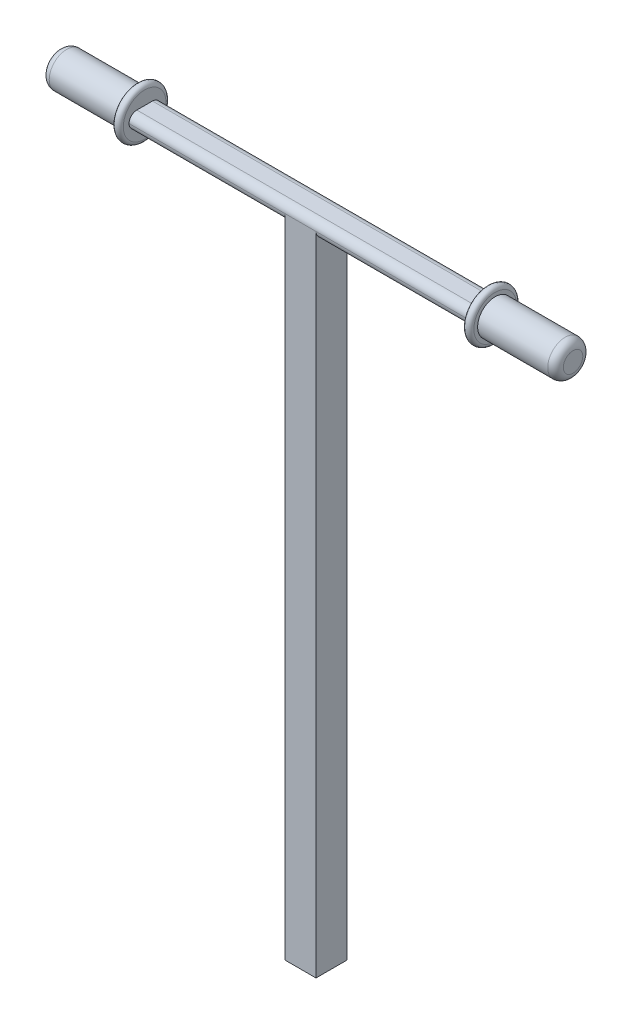
ISO-10303-21;
HEADER;
FILE_DESCRIPTION(('STEP AP214'),'2;1');
FILE_NAME('part.step','',(''),(''),'','','');
FILE_SCHEMA(('AUTOMOTIVE_DESIGN { 1 0 10303 214 1 1 1 1 }'));
ENDSEC;
DATA;
#1=APPLICATION_CONTEXT('core data for automotive mechanical design processes');
#2=APPLICATION_PROTOCOL_DEFINITION('international standard','automotive_design',2000,#1);
#3=PRODUCT_CONTEXT('',#1,'mechanical');
#4=PRODUCT('Part','Part','',(#3));
#5=PRODUCT_RELATED_PRODUCT_CATEGORY('part','',(#4));
#6=PRODUCT_DEFINITION_FORMATION('','',#4);
#7=PRODUCT_DEFINITION_CONTEXT('part definition',#1,'design');
#8=PRODUCT_DEFINITION('design','',#6,#7);
#9=PRODUCT_DEFINITION_SHAPE('','',#8);
#10=(LENGTH_UNIT() NAMED_UNIT(*) SI_UNIT(.MILLI.,.METRE.));
#11=(NAMED_UNIT(*) PLANE_ANGLE_UNIT() SI_UNIT($,.RADIAN.));
#12=(NAMED_UNIT(*) SI_UNIT($,.STERADIAN.) SOLID_ANGLE_UNIT());
#13=UNCERTAINTY_MEASURE_WITH_UNIT(LENGTH_MEASURE(1.E-05),#10,'distance_accuracy_value','');
#14=(GEOMETRIC_REPRESENTATION_CONTEXT(3) GLOBAL_UNCERTAINTY_ASSIGNED_CONTEXT((#13)) GLOBAL_UNIT_ASSIGNED_CONTEXT((#10,
#11,#12)) REPRESENTATION_CONTEXT('',''));
#15=CARTESIAN_POINT('',(0.,0.,0.));
#16=DIRECTION('',(0.,0.,1.));
#17=DIRECTION('',(1.,0.,0.));
#18=AXIS2_PLACEMENT_3D('',#15,#16,#17);
#19=CARTESIAN_POINT('',(-225.,280.,0.));
#20=DIRECTION('',(1.,0.,0.));
#21=DIRECTION('',(0.,1.,0.));
#22=AXIS2_PLACEMENT_3D('',#19,#20,#21);
#23=TOROIDAL_SURFACE('',#22,27.360679774998,4.99999999999994);
#24=CARTESIAN_POINT('',(-220.,280.,0.));
#25=DIRECTION('',(-1.,0.,0.));
#26=DIRECTION('',(0.,-1.,0.));
#27=AXIS2_PLACEMENT_3D('',#24,#25,#26);
#28=CIRCLE('',#27,27.360679774998);
#29=CARTESIAN_POINT('',(-220.,252.639320225002,0.));
#30=VERTEX_POINT('',#29);
#31=EDGE_CURVE('E268',#30,#30,#28,.F.);
#32=ORIENTED_EDGE('',*,*,#31,.F.);
#33=EDGE_LOOP('',(#32));
#34=FACE_BOUND('',#33,.T.);
#35=CARTESIAN_POINT('',(-230.,280.,0.));
#36=DIRECTION('',(-1.,0.,0.));
#37=DIRECTION('',(0.,-1.,0.));
#38=AXIS2_PLACEMENT_3D('',#35,#36,#37);
#39=CIRCLE('',#38,27.360679774998);
#40=CARTESIAN_POINT('',(-230.,252.639320225002,0.));
#41=VERTEX_POINT('',#40);
#42=EDGE_CURVE('E272',#41,#41,#39,.T.);
#43=ORIENTED_EDGE('',*,*,#42,.F.);
#44=EDGE_LOOP('',(#43));
#45=FACE_BOUND('',#44,.T.);
#46=ADVANCED_FACE('F41',(#34,#45),#23,.T.);
#47=CARTESIAN_POINT('',(225.,280.,0.));
#48=DIRECTION('',(1.,0.,0.));
#49=DIRECTION('',(0.,1.,0.));
#50=AXIS2_PLACEMENT_3D('',#47,#48,#49);
#51=TOROIDAL_SURFACE('',#50,27.360679774998,4.99999999999994);
#52=CARTESIAN_POINT('',(230.,280.,0.));
#53=DIRECTION('',(1.,0.,0.));
#54=DIRECTION('',(0.,1.,0.));
#55=AXIS2_PLACEMENT_3D('',#52,#53,#54);
#56=CIRCLE('',#55,27.360679774998);
#57=CARTESIAN_POINT('',(230.,307.360679774998,0.));
#58=VERTEX_POINT('',#57);
#59=EDGE_CURVE('E243',#58,#58,#56,.T.);
#60=ORIENTED_EDGE('',*,*,#59,.F.);
#61=EDGE_LOOP('',(#60));
#62=FACE_BOUND('',#61,.T.);
#63=CARTESIAN_POINT('',(220.,280.,0.));
#64=DIRECTION('',(1.,0.,0.));
#65=DIRECTION('',(0.,1.,0.));
#66=AXIS2_PLACEMENT_3D('',#63,#64,#65);
#67=CIRCLE('',#66,27.360679774998);
#68=CARTESIAN_POINT('',(220.,307.360679774998,0.));
#69=VERTEX_POINT('',#68);
#70=EDGE_CURVE('E264',#69,#69,#67,.F.);
#71=ORIENTED_EDGE('',*,*,#70,.F.);
#72=EDGE_LOOP('',(#71));
#73=FACE_BOUND('',#72,.T.);
#74=ADVANCED_FACE('F299',(#62,#73),#51,.T.);
#75=CARTESIAN_POINT('',(20.,-550.,-20.));
#76=DIRECTION('',(1.,0.,0.));
#77=DIRECTION('',(0.,0.,-1.));
#78=AXIS2_PLACEMENT_3D('',#75,#76,#77);
#79=PLANE('',#78);
#80=DIRECTION('',(0.,0.,-1.));
#81=VECTOR('',#80,1.);
#82=CARTESIAN_POINT('',(20.,270.,-20.));
#83=LINE('',#82,#81);
#84=CARTESIAN_POINT('',(20.,270.,9.99999999999999));
#85=VERTEX_POINT('',#84);
#86=CARTESIAN_POINT('',(20.,270.,-10.));
#87=VERTEX_POINT('',#86);
#88=EDGE_CURVE('E162',#85,#87,#83,.T.);
#89=ORIENTED_EDGE('',*,*,#88,.F.);
#90=CARTESIAN_POINT('',(20.,280.,10.));
#91=DIRECTION('',(1.,0.,0.));
#92=DIRECTION('',(0.,0.,-1.));
#93=AXIS2_PLACEMENT_3D('',#90,#91,#92);
#94=CIRCLE('',#93,10.);
#95=CARTESIAN_POINT('',(20.,280.,20.));
#96=VERTEX_POINT('',#95);
#97=EDGE_CURVE('E224',#85,#96,#94,.F.);
#98=ORIENTED_EDGE('',*,*,#97,.T.);
#99=DIRECTION('',(0.,1.,0.));
#100=VECTOR('',#99,1.);
#101=CARTESIAN_POINT('',(20.,-550.,20.));
#102=LINE('',#101,#100);
#103=CARTESIAN_POINT('',(20.,-550.,20.));
#104=VERTEX_POINT('',#103);
#105=EDGE_CURVE('E160',#104,#96,#102,.T.);
#106=ORIENTED_EDGE('',*,*,#105,.F.);
#107=DIRECTION('',(0.,0.,-1.));
#108=VECTOR('',#107,1.);
#109=CARTESIAN_POINT('',(20.,-550.,-20.));
#110=LINE('',#109,#108);
#111=CARTESIAN_POINT('',(20.,-550.,-20.));
#112=VERTEX_POINT('',#111);
#113=EDGE_CURVE('E151',#104,#112,#110,.T.);
#114=ORIENTED_EDGE('',*,*,#113,.T.);
#115=DIRECTION('',(0.,1.,0.));
#116=VECTOR('',#115,1.);
#117=CARTESIAN_POINT('',(20.,-550.,-20.));
#118=LINE('',#117,#116);
#119=CARTESIAN_POINT('',(20.,280.,-20.));
#120=VERTEX_POINT('',#119);
#121=EDGE_CURVE('E133',#112,#120,#118,.T.);
#122=ORIENTED_EDGE('',*,*,#121,.T.);
#123=CARTESIAN_POINT('',(20.,280.,-10.));
#124=DIRECTION('',(1.,0.,0.));
#125=DIRECTION('',(0.,0.,-1.));
#126=AXIS2_PLACEMENT_3D('',#123,#124,#125);
#127=CIRCLE('',#126,10.);
#128=EDGE_CURVE('E218',#120,#87,#127,.F.);
#129=ORIENTED_EDGE('',*,*,#128,.T.);
#130=EDGE_LOOP('',(#89,#98,#106,#114,#122,#129));
#131=FACE_BOUND('',#130,.T.);
#132=ADVANCED_FACE('F158',(#131),#79,.T.);
#133=CARTESIAN_POINT('',(-20.,-550.,20.));
#134=DIRECTION('',(0.,0.,1.));
#135=DIRECTION('',(1.,0.,0.));
#136=AXIS2_PLACEMENT_3D('',#133,#134,#135);
#137=PLANE('',#136);
#138=ORIENTED_EDGE('',*,*,#105,.T.);
#139=DIRECTION('',(1.,0.,0.));
#140=VECTOR('',#139,1.);
#141=CARTESIAN_POINT('',(-20.,280.,20.));
#142=LINE('',#141,#140);
#143=CARTESIAN_POINT('',(-20.,280.,20.));
#144=VERTEX_POINT('',#143);
#145=EDGE_CURVE('E198',#96,#144,#142,.F.);
#146=ORIENTED_EDGE('',*,*,#145,.T.);
#147=DIRECTION('',(0.,1.,0.));
#148=VECTOR('',#147,1.);
#149=CARTESIAN_POINT('',(-20.,-550.,20.));
#150=LINE('',#149,#148);
#151=CARTESIAN_POINT('',(-20.,-550.,20.));
#152=VERTEX_POINT('',#151);
#153=EDGE_CURVE('E177',#152,#144,#150,.T.);
#154=ORIENTED_EDGE('',*,*,#153,.F.);
#155=DIRECTION('',(1.,0.,0.));
#156=VECTOR('',#155,1.);
#157=CARTESIAN_POINT('',(-20.,-550.,20.));
#158=LINE('',#157,#156);
#159=EDGE_CURVE('E144',#152,#104,#158,.T.);
#160=ORIENTED_EDGE('',*,*,#159,.T.);
#161=EDGE_LOOP('',(#138,#146,#154,#160));
#162=FACE_BOUND('',#161,.T.);
#163=ADVANCED_FACE('F342',(#162),#137,.T.);
#164=CARTESIAN_POINT('',(-20.,-550.,-20.));
#165=DIRECTION('',(-1.,0.,0.));
#166=DIRECTION('',(0.,0.,1.));
#167=AXIS2_PLACEMENT_3D('',#164,#165,#166);
#168=PLANE('',#167);
#169=DIRECTION('',(0.,0.,1.));
#170=VECTOR('',#169,1.);
#171=CARTESIAN_POINT('',(-20.,270.,-20.));
#172=LINE('',#171,#170);
#173=CARTESIAN_POINT('',(-20.,270.,-10.));
#174=VERTEX_POINT('',#173);
#175=CARTESIAN_POINT('',(-20.,270.,9.99999999999999));
#176=VERTEX_POINT('',#175);
#177=EDGE_CURVE('E166',#174,#176,#172,.T.);
#178=ORIENTED_EDGE('',*,*,#177,.F.);
#179=CARTESIAN_POINT('',(-20.,280.,-10.));
#180=DIRECTION('',(-1.,0.,0.));
#181=DIRECTION('',(0.,0.,1.));
#182=AXIS2_PLACEMENT_3D('',#179,#180,#181);
#183=CIRCLE('',#182,10.);
#184=CARTESIAN_POINT('',(-20.,280.,-20.));
#185=VERTEX_POINT('',#184);
#186=EDGE_CURVE('E208',#174,#185,#183,.F.);
#187=ORIENTED_EDGE('',*,*,#186,.T.);
#188=DIRECTION('',(0.,1.,0.));
#189=VECTOR('',#188,1.);
#190=CARTESIAN_POINT('',(-20.,-550.,-20.));
#191=LINE('',#190,#189);
#192=CARTESIAN_POINT('',(-20.,-550.,-20.));
#193=VERTEX_POINT('',#192);
#194=EDGE_CURVE('E143',#193,#185,#191,.T.);
#195=ORIENTED_EDGE('',*,*,#194,.F.);
#196=DIRECTION('',(0.,0.,1.));
#197=VECTOR('',#196,1.);
#198=CARTESIAN_POINT('',(-20.,-550.,-20.));
#199=LINE('',#198,#197);
#200=EDGE_CURVE('E154',#193,#152,#199,.T.);
#201=ORIENTED_EDGE('',*,*,#200,.T.);
#202=ORIENTED_EDGE('',*,*,#153,.T.);
#203=CARTESIAN_POINT('',(-20.,280.,10.));
#204=DIRECTION('',(-1.,0.,0.));
#205=DIRECTION('',(0.,0.,1.));
#206=AXIS2_PLACEMENT_3D('',#203,#204,#205);
#207=CIRCLE('',#206,10.);
#208=EDGE_CURVE('E227',#144,#176,#207,.F.);
#209=ORIENTED_EDGE('',*,*,#208,.T.);
#210=EDGE_LOOP('',(#178,#187,#195,#201,#202,#209));
#211=FACE_BOUND('',#210,.T.);
#212=ADVANCED_FACE('F345',(#211),#168,.T.);
#213=CARTESIAN_POINT('',(-20.,-550.,-20.));
#214=DIRECTION('',(0.,0.,-1.));
#215=DIRECTION('',(-1.,0.,0.));
#216=AXIS2_PLACEMENT_3D('',#213,#214,#215);
#217=PLANE('',#216);
#218=ORIENTED_EDGE('',*,*,#194,.T.);
#219=DIRECTION('',(-1.,0.,0.));
#220=VECTOR('',#219,1.);
#221=CARTESIAN_POINT('',(-20.,280.,-20.));
#222=LINE('',#221,#220);
#223=EDGE_CURVE('E138',#185,#120,#222,.F.);
#224=ORIENTED_EDGE('',*,*,#223,.T.);
#225=ORIENTED_EDGE('',*,*,#121,.F.);
#226=DIRECTION('',(-1.,0.,0.));
#227=VECTOR('',#226,1.);
#228=CARTESIAN_POINT('',(-20.,-550.,-20.));
#229=LINE('',#228,#227);
#230=EDGE_CURVE('E136',#112,#193,#229,.T.);
#231=ORIENTED_EDGE('',*,*,#230,.T.);
#232=EDGE_LOOP('',(#218,#224,#225,#231));
#233=FACE_BOUND('',#232,.T.);
#234=ADVANCED_FACE('F135',(#233),#217,.T.);
#235=CARTESIAN_POINT('',(0.,-550.,0.));
#236=DIRECTION('',(0.,1.,0.));
#237=DIRECTION('',(0.,0.,1.));
#238=AXIS2_PLACEMENT_3D('',#235,#236,#237);
#239=PLANE('',#238);
#240=ORIENTED_EDGE('',*,*,#113,.F.);
#241=ORIENTED_EDGE('',*,*,#159,.F.);
#242=ORIENTED_EDGE('',*,*,#200,.F.);
#243=ORIENTED_EDGE('',*,*,#230,.F.);
#244=EDGE_LOOP('',(#240,#241,#242,#243));
#245=FACE_BOUND('',#244,.T.);
#246=ADVANCED_FACE('F149',(#245),#239,.F.);
#247=CARTESIAN_POINT('',(0.,290.,0.));
#248=DIRECTION('',(0.,1.,0.));
#249=DIRECTION('',(0.,0.,1.));
#250=AXIS2_PLACEMENT_3D('',#247,#248,#249);
#251=PLANE('',#250);
#252=DIRECTION('',(0.,0.,1.));
#253=VECTOR('',#252,1.);
#254=CARTESIAN_POINT('',(220.,290.,-460.454310910905));
#255=LINE('',#254,#253);
#256=CARTESIAN_POINT('',(220.,290.,-10.));
#257=VERTEX_POINT('',#256);
#258=CARTESIAN_POINT('',(220.,290.,10.));
#259=VERTEX_POINT('',#258);
#260=EDGE_CURVE('E410',#257,#259,#255,.T.);
#261=ORIENTED_EDGE('',*,*,#260,.F.);
#262=DIRECTION('',(-1.,0.,0.));
#263=VECTOR('',#262,1.);
#264=CARTESIAN_POINT('',(0.,290.,-10.));
#265=LINE('',#264,#263);
#266=CARTESIAN_POINT('',(-220.,290.,-10.));
#267=VERTEX_POINT('',#266);
#268=EDGE_CURVE('E205',#257,#267,#265,.T.);
#269=ORIENTED_EDGE('',*,*,#268,.T.);
#270=DIRECTION('',(0.,0.,1.));
#271=VECTOR('',#270,1.);
#272=CARTESIAN_POINT('',(-220.,290.,-460.454310910905));
#273=LINE('',#272,#271);
#274=CARTESIAN_POINT('',(-220.,290.,10.));
#275=VERTEX_POINT('',#274);
#276=EDGE_CURVE('E413',#267,#275,#273,.T.);
#277=ORIENTED_EDGE('',*,*,#276,.T.);
#278=DIRECTION('',(1.,0.,0.));
#279=VECTOR('',#278,1.);
#280=CARTESIAN_POINT('',(0.,290.,10.));
#281=LINE('',#280,#279);
#282=EDGE_CURVE('E202',#275,#259,#281,.T.);
#283=ORIENTED_EDGE('',*,*,#282,.T.);
#284=EDGE_LOOP('',(#261,#269,#277,#283));
#285=FACE_BOUND('',#284,.T.);
#286=ADVANCED_FACE('F354',(#285),#251,.T.);
#287=CARTESIAN_POINT('',(220.,270.,-460.454310910905));
#288=DIRECTION('',(0.,-1.,0.));
#289=DIRECTION('',(1.,0.,0.));
#290=AXIS2_PLACEMENT_3D('',#287,#288,#289);
#291=PLANE('',#290);
#292=DIRECTION('',(0.,0.,1.));
#293=VECTOR('',#292,1.);
#294=CARTESIAN_POINT('',(-220.,270.,-460.454310910905));
#295=LINE('',#294,#293);
#296=CARTESIAN_POINT('',(-220.,270.,-10.));
#297=VERTEX_POINT('',#296);
#298=CARTESIAN_POINT('',(-220.,270.,10.));
#299=VERTEX_POINT('',#298);
#300=EDGE_CURVE('E401',#297,#299,#295,.T.);
#301=ORIENTED_EDGE('',*,*,#300,.F.);
#302=DIRECTION('',(1.,0.,0.));
#303=VECTOR('',#302,1.);
#304=CARTESIAN_POINT('',(220.,270.,-10.));
#305=LINE('',#304,#303);
#306=EDGE_CURVE('E185',#297,#174,#305,.T.);
#307=ORIENTED_EDGE('',*,*,#306,.T.);
#308=ORIENTED_EDGE('',*,*,#177,.T.);
#309=DIRECTION('',(1.,0.,0.));
#310=VECTOR('',#309,1.);
#311=CARTESIAN_POINT('',(220.,270.,10.));
#312=LINE('',#311,#310);
#313=EDGE_CURVE('E182',#176,#299,#312,.F.);
#314=ORIENTED_EDGE('',*,*,#313,.T.);
#315=EDGE_LOOP('',(#301,#307,#308,#314));
#316=FACE_BOUND('',#315,.T.);
#317=ADVANCED_FACE('F357',(#316),#291,.T.);
#318=ORIENTED_EDGE('',*,*,#88,.T.);
#319=DIRECTION('',(1.,0.,0.));
#320=VECTOR('',#319,1.);
#321=CARTESIAN_POINT('',(220.,270.,-10.));
#322=LINE('',#321,#320);
#323=CARTESIAN_POINT('',(220.,270.,-10.));
#324=VERTEX_POINT('',#323);
#325=EDGE_CURVE('E195',#87,#324,#322,.T.);
#326=ORIENTED_EDGE('',*,*,#325,.T.);
#327=DIRECTION('',(0.,0.,1.));
#328=VECTOR('',#327,1.);
#329=CARTESIAN_POINT('',(220.,270.,-460.454310910905));
#330=LINE('',#329,#328);
#331=CARTESIAN_POINT('',(220.,270.,10.));
#332=VERTEX_POINT('',#331);
#333=EDGE_CURVE('E404',#324,#332,#330,.T.);
#334=ORIENTED_EDGE('',*,*,#333,.T.);
#335=DIRECTION('',(1.,0.,0.));
#336=VECTOR('',#335,1.);
#337=CARTESIAN_POINT('',(220.,270.,10.));
#338=LINE('',#337,#336);
#339=EDGE_CURVE('E191',#332,#85,#338,.F.);
#340=ORIENTED_EDGE('',*,*,#339,.T.);
#341=EDGE_LOOP('',(#318,#326,#334,#340));
#342=FACE_BOUND('',#341,.T.);
#343=ADVANCED_FACE('F361',(#342),#291,.T.);
#344=CARTESIAN_POINT('',(230.,280.,0.));
#345=DIRECTION('',(1.,0.,0.));
#346=DIRECTION('',(0.,1.,0.));
#347=AXIS2_PLACEMENT_3D('',#344,#345,#346);
#348=PLANE('',#347);
#349=ORIENTED_EDGE('',*,*,#59,.T.);
#350=EDGE_LOOP('',(#349));
#351=FACE_BOUND('',#350,.T.);
#352=CARTESIAN_POINT('',(230.,280.,0.));
#353=DIRECTION('',(1.,0.,0.));
#354=DIRECTION('',(0.,1.,0.));
#355=AXIS2_PLACEMENT_3D('',#352,#353,#354);
#356=CIRCLE('',#355,22.5);
#357=CARTESIAN_POINT('',(230.,302.5,0.));
#358=VERTEX_POINT('',#357);
#359=EDGE_CURVE('E176',#358,#358,#356,.T.);
#360=ORIENTED_EDGE('',*,*,#359,.F.);
#361=EDGE_LOOP('',(#360));
#362=FACE_BOUND('',#361,.T.);
#363=ADVANCED_FACE('F367',(#351,#362),#348,.T.);
#364=CARTESIAN_POINT('',(220.,280.,0.));
#365=DIRECTION('',(1.,0.,0.));
#366=DIRECTION('',(0.,1.,0.));
#367=AXIS2_PLACEMENT_3D('',#364,#365,#366);
#368=PLANE('',#367);
#369=ORIENTED_EDGE('',*,*,#70,.T.);
#370=EDGE_LOOP('',(#369));
#371=FACE_BOUND('',#370,.T.);
#372=CARTESIAN_POINT('',(220.,280.,-10.));
#373=DIRECTION('',(1.,0.,0.));
#374=DIRECTION('',(0.,1.,0.));
#375=AXIS2_PLACEMENT_3D('',#372,#373,#374);
#376=CIRCLE('',#375,10.);
#377=CARTESIAN_POINT('',(220.,280.,-20.));
#378=VERTEX_POINT('',#377);
#379=EDGE_CURVE('E215',#324,#378,#376,.T.);
#380=ORIENTED_EDGE('',*,*,#379,.T.);
#381=CARTESIAN_POINT('',(220.,280.,-10.));
#382=DIRECTION('',(1.,0.,0.));
#383=DIRECTION('',(0.,1.,0.));
#384=AXIS2_PLACEMENT_3D('',#381,#382,#383);
#385=CIRCLE('',#384,10.);
#386=EDGE_CURVE('E235',#378,#257,#385,.T.);
#387=ORIENTED_EDGE('',*,*,#386,.T.);
#388=ORIENTED_EDGE('',*,*,#260,.T.);
#389=CARTESIAN_POINT('',(220.,280.,10.));
#390=DIRECTION('',(1.,0.,0.));
#391=DIRECTION('',(0.,1.,0.));
#392=AXIS2_PLACEMENT_3D('',#389,#390,#391);
#393=CIRCLE('',#392,10.);
#394=CARTESIAN_POINT('',(220.,280.,20.));
#395=VERTEX_POINT('',#394);
#396=EDGE_CURVE('E65',#259,#395,#393,.T.);
#397=ORIENTED_EDGE('',*,*,#396,.T.);
#398=CARTESIAN_POINT('',(220.,280.,10.));
#399=DIRECTION('',(1.,0.,0.));
#400=DIRECTION('',(0.,1.,0.));
#401=AXIS2_PLACEMENT_3D('',#398,#399,#400);
#402=CIRCLE('',#401,10.);
#403=EDGE_CURVE('E221',#395,#332,#402,.T.);
#404=ORIENTED_EDGE('',*,*,#403,.T.);
#405=ORIENTED_EDGE('',*,*,#333,.F.);
#406=EDGE_LOOP('',(#380,#387,#388,#397,#404,#405));
#407=FACE_BOUND('',#406,.T.);
#408=ADVANCED_FACE('F363',(#371,#407),#368,.F.);
#409=CARTESIAN_POINT('',(330.,280.,0.));
#410=DIRECTION('',(-1.,0.,0.));
#411=DIRECTION('',(0.,-1.,0.));
#412=AXIS2_PLACEMENT_3D('',#409,#410,#411);
#413=CYLINDRICAL_SURFACE('',#412,22.5);
#414=CARTESIAN_POINT('',(320.,280.,0.));
#415=DIRECTION('',(1.,0.,0.));
#416=DIRECTION('',(0.,1.,0.));
#417=AXIS2_PLACEMENT_3D('',#414,#415,#416);
#418=CIRCLE('',#417,22.5);
#419=CARTESIAN_POINT('',(320.,302.5,0.));
#420=VERTEX_POINT('',#419);
#421=EDGE_CURVE('E11',#420,#420,#418,.F.);
#422=ORIENTED_EDGE('',*,*,#421,.T.);
#423=EDGE_LOOP('',(#422));
#424=FACE_BOUND('',#423,.T.);
#425=ORIENTED_EDGE('',*,*,#359,.T.);
#426=EDGE_LOOP('',(#425));
#427=FACE_BOUND('',#426,.T.);
#428=ADVANCED_FACE('F366',(#424,#427),#413,.T.);
#429=CARTESIAN_POINT('',(330.,280.,0.));
#430=DIRECTION('',(1.,0.,0.));
#431=DIRECTION('',(0.,1.,0.));
#432=AXIS2_PLACEMENT_3D('',#429,#430,#431);
#433=PLANE('',#432);
#434=CARTESIAN_POINT('',(330.,280.,0.));
#435=DIRECTION('',(1.,0.,0.));
#436=DIRECTION('',(0.,1.,0.));
#437=AXIS2_PLACEMENT_3D('',#434,#435,#436);
#438=CIRCLE('',#437,12.5);
#439=CARTESIAN_POINT('',(330.,292.5,0.));
#440=VERTEX_POINT('',#439);
#441=EDGE_CURVE('E50',#440,#440,#438,.T.);
#442=ORIENTED_EDGE('',*,*,#441,.T.);
#443=EDGE_LOOP('',(#442));
#444=FACE_BOUND('',#443,.T.);
#445=ADVANCED_FACE('F287',(#444),#433,.T.);
#446=CARTESIAN_POINT('',(-230.,280.,0.));
#447=DIRECTION('',(-1.,0.,0.));
#448=DIRECTION('',(0.,1.,0.));
#449=AXIS2_PLACEMENT_3D('',#446,#447,#448);
#450=PLANE('',#449);
#451=ORIENTED_EDGE('',*,*,#42,.T.);
#452=EDGE_LOOP('',(#451));
#453=FACE_BOUND('',#452,.T.);
#454=CARTESIAN_POINT('',(-230.,280.,0.));
#455=DIRECTION('',(1.,0.,0.));
#456=DIRECTION('',(0.,1.,0.));
#457=AXIS2_PLACEMENT_3D('',#454,#455,#456);
#458=CIRCLE('',#457,22.5);
#459=CARTESIAN_POINT('',(-230.,302.5,0.));
#460=VERTEX_POINT('',#459);
#461=EDGE_CURVE('E253',#460,#460,#458,.T.);
#462=ORIENTED_EDGE('',*,*,#461,.T.);
#463=EDGE_LOOP('',(#462));
#464=FACE_BOUND('',#463,.T.);
#465=ADVANCED_FACE('F377',(#453,#464),#450,.T.);
#466=CARTESIAN_POINT('',(-220.,280.,0.));
#467=DIRECTION('',(-1.,0.,0.));
#468=DIRECTION('',(0.,1.,0.));
#469=AXIS2_PLACEMENT_3D('',#466,#467,#468);
#470=PLANE('',#469);
#471=ORIENTED_EDGE('',*,*,#31,.T.);
#472=EDGE_LOOP('',(#471));
#473=FACE_BOUND('',#472,.T.);
#474=ORIENTED_EDGE('',*,*,#276,.F.);
#475=CARTESIAN_POINT('',(-220.,280.,-10.));
#476=DIRECTION('',(-1.,0.,0.));
#477=DIRECTION('',(0.,-1.,0.));
#478=AXIS2_PLACEMENT_3D('',#475,#476,#477);
#479=CIRCLE('',#478,10.);
#480=CARTESIAN_POINT('',(-220.,280.,-20.));
#481=VERTEX_POINT('',#480);
#482=EDGE_CURVE('E232',#267,#481,#479,.T.);
#483=ORIENTED_EDGE('',*,*,#482,.T.);
#484=CARTESIAN_POINT('',(-220.,280.,-10.));
#485=DIRECTION('',(-1.,0.,0.));
#486=DIRECTION('',(0.,-1.,0.));
#487=AXIS2_PLACEMENT_3D('',#484,#485,#486);
#488=CIRCLE('',#487,10.);
#489=EDGE_CURVE('E212',#481,#297,#488,.T.);
#490=ORIENTED_EDGE('',*,*,#489,.T.);
#491=ORIENTED_EDGE('',*,*,#300,.T.);
#492=CARTESIAN_POINT('',(-220.,280.,10.));
#493=DIRECTION('',(-1.,0.,0.));
#494=DIRECTION('',(0.,-1.,0.));
#495=AXIS2_PLACEMENT_3D('',#492,#493,#494);
#496=CIRCLE('',#495,10.);
#497=CARTESIAN_POINT('',(-220.,280.,20.));
#498=VERTEX_POINT('',#497);
#499=EDGE_CURVE('E57',#299,#498,#496,.T.);
#500=ORIENTED_EDGE('',*,*,#499,.T.);
#501=CARTESIAN_POINT('',(-220.,280.,10.));
#502=DIRECTION('',(-1.,0.,0.));
#503=DIRECTION('',(0.,-1.,0.));
#504=AXIS2_PLACEMENT_3D('',#501,#502,#503);
#505=CIRCLE('',#504,10.);
#506=EDGE_CURVE('E240',#498,#275,#505,.T.);
#507=ORIENTED_EDGE('',*,*,#506,.T.);
#508=EDGE_LOOP('',(#474,#483,#490,#491,#500,#507));
#509=FACE_BOUND('',#508,.T.);
#510=ADVANCED_FACE('F378',(#473,#509),#470,.F.);
#511=CARTESIAN_POINT('',(-330.,280.,0.));
#512=DIRECTION('',(1.,0.,0.));
#513=DIRECTION('',(0.,1.,0.));
#514=AXIS2_PLACEMENT_3D('',#511,#512,#513);
#515=CYLINDRICAL_SURFACE('',#514,22.5);
#516=CARTESIAN_POINT('',(-320.,280.,0.));
#517=DIRECTION('',(-1.,0.,0.));
#518=DIRECTION('',(0.,-1.,0.));
#519=AXIS2_PLACEMENT_3D('',#516,#517,#518);
#520=CIRCLE('',#519,22.5);
#521=CARTESIAN_POINT('',(-320.,257.5,0.));
#522=VERTEX_POINT('',#521);
#523=EDGE_CURVE('E276',#522,#522,#520,.F.);
#524=ORIENTED_EDGE('',*,*,#523,.T.);
#525=EDGE_LOOP('',(#524));
#526=FACE_BOUND('',#525,.T.);
#527=ORIENTED_EDGE('',*,*,#461,.F.);
#528=EDGE_LOOP('',(#527));
#529=FACE_BOUND('',#528,.T.);
#530=ADVANCED_FACE('F381',(#526,#529),#515,.T.);
#531=CARTESIAN_POINT('',(-330.,280.,0.));
#532=DIRECTION('',(-1.,0.,0.));
#533=DIRECTION('',(0.,1.,0.));
#534=AXIS2_PLACEMENT_3D('',#531,#532,#533);
#535=PLANE('',#534);
#536=CARTESIAN_POINT('',(-330.,280.,0.));
#537=DIRECTION('',(-1.,0.,0.));
#538=DIRECTION('',(0.,-1.,0.));
#539=AXIS2_PLACEMENT_3D('',#536,#537,#538);
#540=CIRCLE('',#539,12.5);
#541=CARTESIAN_POINT('',(-330.,267.5,0.));
#542=VERTEX_POINT('',#541);
#543=EDGE_CURVE('E280',#542,#542,#540,.T.);
#544=ORIENTED_EDGE('',*,*,#543,.T.);
#545=EDGE_LOOP('',(#544));
#546=FACE_BOUND('',#545,.T.);
#547=ADVANCED_FACE('F332',(#546),#535,.T.);
#548=CARTESIAN_POINT('',(220.,280.,-10.));
#549=DIRECTION('',(1.,0.,0.));
#550=DIRECTION('',(0.,1.,0.));
#551=AXIS2_PLACEMENT_3D('',#548,#549,#550);
#552=CYLINDRICAL_SURFACE('',#551,10.);
#553=ORIENTED_EDGE('',*,*,#325,.F.);
#554=ORIENTED_EDGE('',*,*,#128,.F.);
#555=DIRECTION('',(1.,0.,0.));
#556=VECTOR('',#555,1.);
#557=CARTESIAN_POINT('',(-20.0000000000001,280.,-20.));
#558=LINE('',#557,#556);
#559=EDGE_CURVE('E248',#378,#120,#558,.F.);
#560=ORIENTED_EDGE('',*,*,#559,.F.);
#561=ORIENTED_EDGE('',*,*,#379,.F.);
#562=EDGE_LOOP('',(#553,#554,#560,#561));
#563=FACE_BOUND('',#562,.T.);
#564=ADVANCED_FACE('F328',(#563),#552,.T.);
#565=CARTESIAN_POINT('',(0.,280.,-10.));
#566=DIRECTION('',(-1.,0.,0.));
#567=DIRECTION('',(0.,0.,1.));
#568=AXIS2_PLACEMENT_3D('',#565,#566,#567);
#569=CYLINDRICAL_SURFACE('',#568,10.);
#570=DIRECTION('',(-1.,0.,0.));
#571=VECTOR('',#570,1.);
#572=CARTESIAN_POINT('',(-20.,280.,-20.));
#573=LINE('',#572,#571);
#574=EDGE_CURVE('E244',#481,#185,#573,.F.);
#575=ORIENTED_EDGE('',*,*,#574,.F.);
#576=ORIENTED_EDGE('',*,*,#482,.F.);
#577=ORIENTED_EDGE('',*,*,#268,.F.);
#578=ORIENTED_EDGE('',*,*,#386,.F.);
#579=ORIENTED_EDGE('',*,*,#559,.T.);
#580=ORIENTED_EDGE('',*,*,#223,.F.);
#581=EDGE_LOOP('',(#575,#576,#577,#578,#579,#580));
#582=FACE_BOUND('',#581,.T.);
#583=ADVANCED_FACE('F331',(#582),#569,.T.);
#584=CARTESIAN_POINT('',(220.,280.,-10.));
#585=DIRECTION('',(1.,0.,0.));
#586=DIRECTION('',(0.,1.,0.));
#587=AXIS2_PLACEMENT_3D('',#584,#585,#586);
#588=CYLINDRICAL_SURFACE('',#587,10.);
#589=ORIENTED_EDGE('',*,*,#489,.F.);
#590=ORIENTED_EDGE('',*,*,#574,.T.);
#591=ORIENTED_EDGE('',*,*,#186,.F.);
#592=ORIENTED_EDGE('',*,*,#306,.F.);
#593=EDGE_LOOP('',(#589,#590,#591,#592));
#594=FACE_BOUND('',#593,.T.);
#595=ADVANCED_FACE('F320',(#594),#588,.T.);
#596=CARTESIAN_POINT('',(-20.0000000000001,280.,10.));
#597=DIRECTION('',(1.,0.,0.));
#598=DIRECTION('',(0.,1.,0.));
#599=AXIS2_PLACEMENT_3D('',#596,#597,#598);
#600=CYLINDRICAL_SURFACE('',#599,10.);
#601=ORIENTED_EDGE('',*,*,#313,.F.);
#602=ORIENTED_EDGE('',*,*,#208,.F.);
#603=DIRECTION('',(1.,0.,0.));
#604=VECTOR('',#603,1.);
#605=CARTESIAN_POINT('',(-20.0000000000001,280.,20.));
#606=LINE('',#605,#604);
#607=EDGE_CURVE('E249',#498,#144,#606,.T.);
#608=ORIENTED_EDGE('',*,*,#607,.F.);
#609=ORIENTED_EDGE('',*,*,#499,.F.);
#610=EDGE_LOOP('',(#601,#602,#608,#609));
#611=FACE_BOUND('',#610,.T.);
#612=ADVANCED_FACE('F316',(#611),#600,.T.);
#613=CARTESIAN_POINT('',(0.,280.,10.));
#614=DIRECTION('',(1.,0.,0.));
#615=DIRECTION('',(0.,0.,-1.));
#616=AXIS2_PLACEMENT_3D('',#613,#614,#615);
#617=CYLINDRICAL_SURFACE('',#616,10.);
#618=ORIENTED_EDGE('',*,*,#607,.T.);
#619=ORIENTED_EDGE('',*,*,#145,.F.);
#620=DIRECTION('',(1.,0.,0.));
#621=VECTOR('',#620,1.);
#622=CARTESIAN_POINT('',(-20.,280.,20.));
#623=LINE('',#622,#621);
#624=EDGE_CURVE('E254',#395,#96,#623,.F.);
#625=ORIENTED_EDGE('',*,*,#624,.F.);
#626=ORIENTED_EDGE('',*,*,#396,.F.);
#627=ORIENTED_EDGE('',*,*,#282,.F.);
#628=ORIENTED_EDGE('',*,*,#506,.F.);
#629=EDGE_LOOP('',(#618,#619,#625,#626,#627,#628));
#630=FACE_BOUND('',#629,.T.);
#631=ADVANCED_FACE('F319',(#630),#617,.T.);
#632=CARTESIAN_POINT('',(-20.0000000000001,280.,10.));
#633=DIRECTION('',(1.,0.,0.));
#634=DIRECTION('',(0.,1.,0.));
#635=AXIS2_PLACEMENT_3D('',#632,#633,#634);
#636=CYLINDRICAL_SURFACE('',#635,10.);
#637=ORIENTED_EDGE('',*,*,#97,.F.);
#638=ORIENTED_EDGE('',*,*,#339,.F.);
#639=ORIENTED_EDGE('',*,*,#403,.F.);
#640=ORIENTED_EDGE('',*,*,#624,.T.);
#641=EDGE_LOOP('',(#637,#638,#639,#640));
#642=FACE_BOUND('',#641,.T.);
#643=ADVANCED_FACE('F295',(#642),#636,.T.);
#644=CARTESIAN_POINT('',(-320.,280.,0.));
#645=DIRECTION('',(-1.,0.,0.));
#646=DIRECTION('',(0.,-1.,0.));
#647=AXIS2_PLACEMENT_3D('',#644,#645,#646);
#648=TOROIDAL_SURFACE('',#647,12.5,10.);
#649=ORIENTED_EDGE('',*,*,#543,.F.);
#650=EDGE_LOOP('',(#649));
#651=FACE_BOUND('',#650,.T.);
#652=ORIENTED_EDGE('',*,*,#523,.F.);
#653=EDGE_LOOP('',(#652));
#654=FACE_BOUND('',#653,.T.);
#655=ADVANCED_FACE('F290',(#651,#654),#648,.T.);
#656=CARTESIAN_POINT('',(320.,280.,0.));
#657=DIRECTION('',(1.,0.,0.));
#658=DIRECTION('',(0.,1.,0.));
#659=AXIS2_PLACEMENT_3D('',#656,#657,#658);
#660=TOROIDAL_SURFACE('',#659,12.5,10.);
#661=ORIENTED_EDGE('',*,*,#421,.F.);
#662=EDGE_LOOP('',(#661));
#663=FACE_BOUND('',#662,.T.);
#664=ORIENTED_EDGE('',*,*,#441,.F.);
#665=EDGE_LOOP('',(#664));
#666=FACE_BOUND('',#665,.T.);
#667=ADVANCED_FACE('F43',(#663,#666),#660,.T.);
#668=CLOSED_SHELL('',(#46,#74,#132,#163,#212,#234,#246,#286,#317,#343,#363,#408,#428,#445,#465,
#510,#530,#547,#564,#583,#595,#612,#631,#643,#655,#667));
#669=MANIFOLD_SOLID_BREP('B2',#668);
#670=ADVANCED_BREP_SHAPE_REPRESENTATION('',(#18,#669),#14);
#671=SHAPE_DEFINITION_REPRESENTATION(#9,#670);
ENDSEC;
END-ISO-10303-21;
